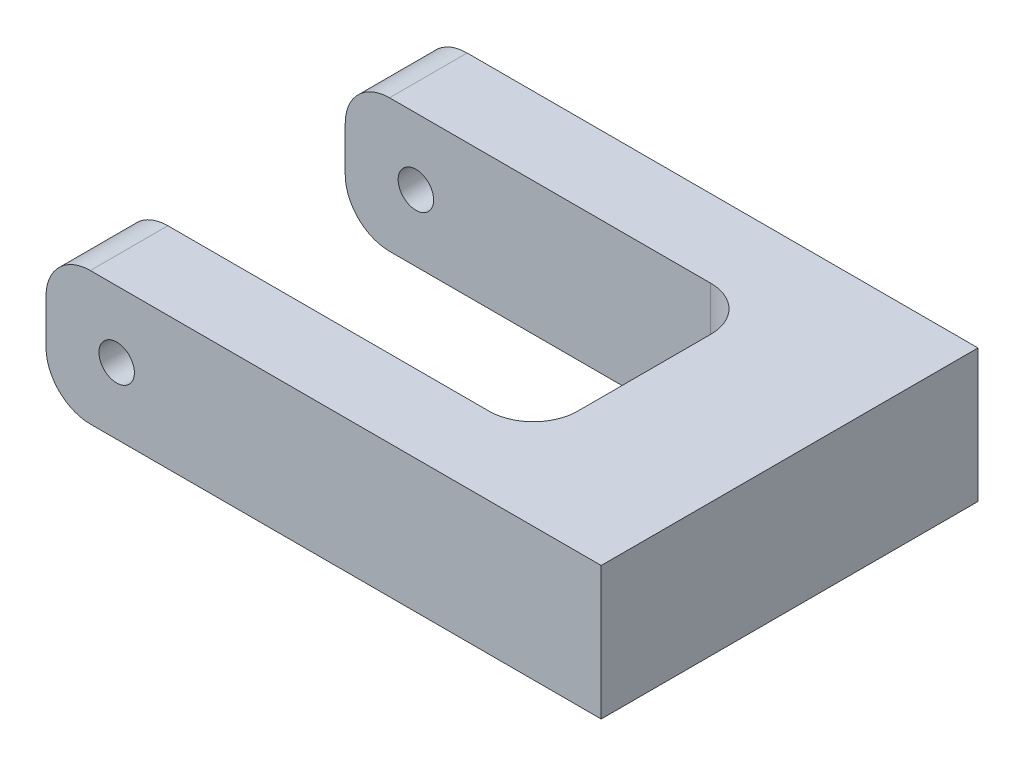
ISO-10303-21;
HEADER;
FILE_DESCRIPTION(('STEP AP214'),'2;1');
FILE_NAME('part.step','',(''),(''),'','','');
FILE_SCHEMA(('AUTOMOTIVE_DESIGN { 1 0 10303 214 1 1 1 1 }'));
ENDSEC;
DATA;
#1=APPLICATION_CONTEXT('core data for automotive mechanical design processes');
#2=APPLICATION_PROTOCOL_DEFINITION('international standard','automotive_design',2000,#1);
#3=PRODUCT_CONTEXT('',#1,'mechanical');
#4=PRODUCT('Part','Part','',(#3));
#5=PRODUCT_RELATED_PRODUCT_CATEGORY('part','',(#4));
#6=PRODUCT_DEFINITION_FORMATION('','',#4);
#7=PRODUCT_DEFINITION_CONTEXT('part definition',#1,'design');
#8=PRODUCT_DEFINITION('design','',#6,#7);
#9=PRODUCT_DEFINITION_SHAPE('','',#8);
#10=(LENGTH_UNIT() NAMED_UNIT(*) SI_UNIT(.MILLI.,.METRE.));
#11=(NAMED_UNIT(*) PLANE_ANGLE_UNIT() SI_UNIT($,.RADIAN.));
#12=(NAMED_UNIT(*) SI_UNIT($,.STERADIAN.) SOLID_ANGLE_UNIT());
#13=UNCERTAINTY_MEASURE_WITH_UNIT(LENGTH_MEASURE(1.E-05),#10,'distance_accuracy_value','');
#14=(GEOMETRIC_REPRESENTATION_CONTEXT(3) GLOBAL_UNCERTAINTY_ASSIGNED_CONTEXT((#13)) GLOBAL_UNIT_ASSIGNED_CONTEXT((#10,
#11,#12)) REPRESENTATION_CONTEXT('',''));
#15=CARTESIAN_POINT('',(0.,0.,0.));
#16=DIRECTION('',(0.,0.,1.));
#17=DIRECTION('',(1.,0.,0.));
#18=AXIS2_PLACEMENT_3D('',#15,#16,#17);
#19=CARTESIAN_POINT('',(9.88514391780015,-4.0419007614435,-77.5));
#20=DIRECTION('',(0.,0.,1.));
#21=DIRECTION('',(1.,0.,0.));
#22=AXIS2_PLACEMENT_3D('',#19,#20,#21);
#23=CYLINDRICAL_SURFACE('',#22,10.);
#24=CARTESIAN_POINT('',(9.88514391780015,-4.0419007614435,-60.));
#25=DIRECTION('',(0.,0.,-1.));
#26=DIRECTION('',(-1.,0.,0.));
#27=AXIS2_PLACEMENT_3D('',#24,#25,#26);
#28=CIRCLE('',#27,10.);
#29=CARTESIAN_POINT('',(9.88514391780015,5.9580992385565,-60.));
#30=VERTEX_POINT('',#29);
#31=CARTESIAN_POINT('',(-0.114856082199853,-4.0419007614435,-60.));
#32=VERTEX_POINT('',#31);
#33=EDGE_CURVE('E212',#30,#32,#28,.F.);
#34=ORIENTED_EDGE('',*,*,#33,.F.);
#35=DIRECTION('',(0.,0.,1.));
#36=VECTOR('',#35,1.);
#37=CARTESIAN_POINT('',(9.88514391780015,5.9580992385565,-77.5));
#38=LINE('',#37,#36);
#39=CARTESIAN_POINT('',(9.88514391780015,5.9580992385565,-77.5));
#40=VERTEX_POINT('',#39);
#41=EDGE_CURVE('E144',#40,#30,#38,.T.);
#42=ORIENTED_EDGE('',*,*,#41,.F.);
#43=CARTESIAN_POINT('',(9.88514391780015,-4.0419007614435,-77.5));
#44=DIRECTION('',(0.,0.,1.));
#45=DIRECTION('',(-1.,0.,0.));
#46=AXIS2_PLACEMENT_3D('',#43,#44,#45);
#47=CIRCLE('',#46,10.);
#48=CARTESIAN_POINT('',(-0.114856082199853,-4.0419007614435,-77.5));
#49=VERTEX_POINT('',#48);
#50=EDGE_CURVE('E219',#40,#49,#47,.T.);
#51=ORIENTED_EDGE('',*,*,#50,.T.);
#52=DIRECTION('',(0.,0.,1.));
#53=VECTOR('',#52,1.);
#54=CARTESIAN_POINT('',(-0.114856082199853,-4.0419007614435,-77.5));
#55=LINE('',#54,#53);
#56=EDGE_CURVE('E160',#49,#32,#55,.T.);
#57=ORIENTED_EDGE('',*,*,#56,.T.);
#58=EDGE_LOOP('',(#34,#42,#51,#57));
#59=FACE_BOUND('',#58,.T.);
#60=ADVANCED_FACE('F32',(#59),#23,.T.);
#61=CARTESIAN_POINT('',(9.88514391780015,-14.0419007614435,-77.5));
#62=DIRECTION('',(0.,0.,1.));
#63=DIRECTION('',(1.,0.,0.));
#64=AXIS2_PLACEMENT_3D('',#61,#62,#63);
#65=CYLINDRICAL_SURFACE('',#64,10.);
#66=CARTESIAN_POINT('',(9.88514391780015,-14.0419007614435,-60.));
#67=DIRECTION('',(0.,0.,-1.));
#68=DIRECTION('',(-1.,0.,0.));
#69=AXIS2_PLACEMENT_3D('',#66,#67,#68);
#70=CIRCLE('',#69,10.);
#71=CARTESIAN_POINT('',(-0.114856082199851,-14.0419007614435,-60.));
#72=VERTEX_POINT('',#71);
#73=CARTESIAN_POINT('',(9.88514391780015,-24.0419007614435,-60.));
#74=VERTEX_POINT('',#73);
#75=EDGE_CURVE('E210',#72,#74,#70,.F.);
#76=ORIENTED_EDGE('',*,*,#75,.F.);
#77=DIRECTION('',(0.,0.,1.));
#78=VECTOR('',#77,1.);
#79=CARTESIAN_POINT('',(-0.114856082199851,-14.0419007614435,-77.5));
#80=LINE('',#79,#78);
#81=CARTESIAN_POINT('',(-0.114856082199851,-14.0419007614435,-77.5));
#82=VERTEX_POINT('',#81);
#83=EDGE_CURVE('E169',#82,#72,#80,.T.);
#84=ORIENTED_EDGE('',*,*,#83,.F.);
#85=CARTESIAN_POINT('',(9.88514391780015,-14.0419007614435,-77.5));
#86=DIRECTION('',(0.,0.,1.));
#87=DIRECTION('',(1.,0.,0.));
#88=AXIS2_PLACEMENT_3D('',#85,#86,#87);
#89=CIRCLE('',#88,10.);
#90=CARTESIAN_POINT('',(9.88514391780015,-24.0419007614435,-77.5));
#91=VERTEX_POINT('',#90);
#92=EDGE_CURVE('E226',#82,#91,#89,.T.);
#93=ORIENTED_EDGE('',*,*,#92,.T.);
#94=DIRECTION('',(0.,0.,1.));
#95=VECTOR('',#94,1.);
#96=CARTESIAN_POINT('',(9.88514391780015,-24.0419007614435,-77.5));
#97=LINE('',#96,#95);
#98=EDGE_CURVE('E251',#91,#74,#97,.T.);
#99=ORIENTED_EDGE('',*,*,#98,.T.);
#100=EDGE_LOOP('',(#76,#84,#93,#99));
#101=FACE_BOUND('',#100,.T.);
#102=ADVANCED_FACE('F294',(#101),#65,.T.);
#103=CARTESIAN_POINT('',(-0.114856082199853,-4.0419007614435,-77.5));
#104=DIRECTION('',(-1.,0.,0.));
#105=DIRECTION('',(0.,-1.,0.));
#106=AXIS2_PLACEMENT_3D('',#103,#104,#105);
#107=PLANE('',#106);
#108=DIRECTION('',(0.,-1.,0.));
#109=VECTOR('',#108,1.);
#110=CARTESIAN_POINT('',(-0.114856082199853,-4.0419007614435,-60.));
#111=LINE('',#110,#109);
#112=EDGE_CURVE('E143',#32,#72,#111,.T.);
#113=ORIENTED_EDGE('',*,*,#112,.F.);
#114=ORIENTED_EDGE('',*,*,#56,.F.);
#115=DIRECTION('',(0.,-1.,0.));
#116=VECTOR('',#115,1.);
#117=CARTESIAN_POINT('',(-0.114856082199853,-4.0419007614435,-77.5));
#118=LINE('',#117,#116);
#119=EDGE_CURVE('E222',#49,#82,#118,.T.);
#120=ORIENTED_EDGE('',*,*,#119,.T.);
#121=ORIENTED_EDGE('',*,*,#83,.T.);
#122=EDGE_LOOP('',(#113,#114,#120,#121));
#123=FACE_BOUND('',#122,.T.);
#124=ADVANCED_FACE('F300',(#123),#107,.T.);
#125=CARTESIAN_POINT('',(9.88514391780015,-4.0419007614435,-10.));
#126=DIRECTION('',(0.,0.,1.));
#127=DIRECTION('',(1.,0.,0.));
#128=AXIS2_PLACEMENT_3D('',#125,#126,#127);
#129=CIRCLE('',#128,10.);
#130=CARTESIAN_POINT('',(-0.114856082199853,-4.0419007614435,-10.));
#131=VERTEX_POINT('',#130);
#132=CARTESIAN_POINT('',(9.88514391780015,5.9580992385565,-10.));
#133=VERTEX_POINT('',#132);
#134=EDGE_CURVE('E136',#131,#133,#129,.F.);
#135=ORIENTED_EDGE('',*,*,#134,.F.);
#136=CARTESIAN_POINT('',(-0.114856082199853,-4.0419007614435,7.5));
#137=VERTEX_POINT('',#136);
#138=EDGE_CURVE('E150',#131,#137,#55,.T.);
#139=ORIENTED_EDGE('',*,*,#138,.T.);
#140=CARTESIAN_POINT('',(9.88514391780015,-4.0419007614435,7.5));
#141=DIRECTION('',(0.,0.,1.));
#142=DIRECTION('',(-1.,0.,0.));
#143=AXIS2_PLACEMENT_3D('',#140,#141,#142);
#144=CIRCLE('',#143,10.);
#145=CARTESIAN_POINT('',(9.88514391780015,5.9580992385565,7.5));
#146=VERTEX_POINT('',#145);
#147=EDGE_CURVE('E203',#146,#137,#144,.T.);
#148=ORIENTED_EDGE('',*,*,#147,.F.);
#149=EDGE_CURVE('E152',#133,#146,#38,.T.);
#150=ORIENTED_EDGE('',*,*,#149,.F.);
#151=EDGE_LOOP('',(#135,#139,#148,#150));
#152=FACE_BOUND('',#151,.T.);
#153=ADVANCED_FACE('F148',(#152),#23,.T.);
#154=CARTESIAN_POINT('',(9.88514391780015,5.9580992385565,-77.5));
#155=DIRECTION('',(0.,1.,0.));
#156=DIRECTION('',(0.,0.,1.));
#157=AXIS2_PLACEMENT_3D('',#154,#155,#156);
#158=PLANE('',#157);
#159=DIRECTION('',(-1.,0.,0.));
#160=VECTOR('',#159,1.);
#161=CARTESIAN_POINT('',(9.88514391780015,5.9580992385565,-60.));
#162=LINE('',#161,#160);
#163=CARTESIAN_POINT('',(82.3281950153062,5.9580992385565,-60.));
#164=VERTEX_POINT('',#163);
#165=EDGE_CURVE('E199',#164,#30,#162,.T.);
#166=ORIENTED_EDGE('',*,*,#165,.F.);
#167=CARTESIAN_POINT('',(82.3281950153062,5.9580992385565,-50.));
#168=DIRECTION('',(0.,1.,0.));
#169=DIRECTION('',(0.,0.,1.));
#170=AXIS2_PLACEMENT_3D('',#167,#168,#169);
#171=CIRCLE('',#170,10.);
#172=CARTESIAN_POINT('',(92.3281950153062,5.9580992385565,-50.));
#173=VERTEX_POINT('',#172);
#174=EDGE_CURVE('E40',#164,#173,#171,.F.);
#175=ORIENTED_EDGE('',*,*,#174,.T.);
#176=DIRECTION('',(0.,0.,-1.));
#177=VECTOR('',#176,1.);
#178=CARTESIAN_POINT('',(92.3281950153062,5.9580992385565,-77.5));
#179=LINE('',#178,#177);
#180=CARTESIAN_POINT('',(92.3281950153062,5.9580992385565,-20.));
#181=VERTEX_POINT('',#180);
#182=EDGE_CURVE('E197',#181,#173,#179,.T.);
#183=ORIENTED_EDGE('',*,*,#182,.F.);
#184=CARTESIAN_POINT('',(82.3281950153062,5.9580992385565,-20.));
#185=DIRECTION('',(0.,1.,0.));
#186=DIRECTION('',(0.,0.,1.));
#187=AXIS2_PLACEMENT_3D('',#184,#185,#186);
#188=CIRCLE('',#187,10.);
#189=CARTESIAN_POINT('',(82.3281950153062,5.9580992385565,-10.));
#190=VERTEX_POINT('',#189);
#191=EDGE_CURVE('E189',#181,#190,#188,.F.);
#192=ORIENTED_EDGE('',*,*,#191,.T.);
#193=DIRECTION('',(1.,0.,0.));
#194=VECTOR('',#193,1.);
#195=CARTESIAN_POINT('',(9.88514391780015,5.9580992385565,-10.));
#196=LINE('',#195,#194);
#197=EDGE_CURVE('E153',#133,#190,#196,.T.);
#198=ORIENTED_EDGE('',*,*,#197,.F.);
#199=ORIENTED_EDGE('',*,*,#149,.T.);
#200=DIRECTION('',(-1.,0.,0.));
#201=VECTOR('',#200,1.);
#202=CARTESIAN_POINT('',(9.88514391780015,5.9580992385565,7.5));
#203=LINE('',#202,#201);
#204=CARTESIAN_POINT('',(125.13165801171,5.9580992385565,7.5));
#205=VERTEX_POINT('',#204);
#206=EDGE_CURVE('E223',#205,#146,#203,.T.);
#207=ORIENTED_EDGE('',*,*,#206,.F.);
#208=DIRECTION('',(0.,0.,1.));
#209=VECTOR('',#208,1.);
#210=CARTESIAN_POINT('',(125.13165801171,5.9580992385565,-77.5));
#211=LINE('',#210,#209);
#212=CARTESIAN_POINT('',(125.13165801171,5.9580992385565,-77.5));
#213=VERTEX_POINT('',#212);
#214=EDGE_CURVE('E248',#213,#205,#211,.T.);
#215=ORIENTED_EDGE('',*,*,#214,.F.);
#216=DIRECTION('',(-1.,0.,0.));
#217=VECTOR('',#216,1.);
#218=CARTESIAN_POINT('',(9.88514391780015,5.9580992385565,-77.5));
#219=LINE('',#218,#217);
#220=EDGE_CURVE('E161',#213,#40,#219,.T.);
#221=ORIENTED_EDGE('',*,*,#220,.T.);
#222=ORIENTED_EDGE('',*,*,#41,.T.);
#223=EDGE_LOOP('',(#166,#175,#183,#192,#198,#199,#207,#215,#221,#222));
#224=FACE_BOUND('',#223,.T.);
#225=ADVANCED_FACE('F196',(#224),#158,.T.);
#226=CARTESIAN_POINT('',(125.13165801171,5.9580992385565,-77.5));
#227=DIRECTION('',(1.,0.,0.));
#228=DIRECTION('',(0.,0.,-1.));
#229=AXIS2_PLACEMENT_3D('',#226,#227,#228);
#230=PLANE('',#229);
#231=DIRECTION('',(0.,1.,0.));
#232=VECTOR('',#231,1.);
#233=CARTESIAN_POINT('',(125.13165801171,5.9580992385565,7.5));
#234=LINE('',#233,#232);
#235=CARTESIAN_POINT('',(125.13165801171,-24.0419007614435,7.5));
#236=VERTEX_POINT('',#235);
#237=EDGE_CURVE('E242',#236,#205,#234,.T.);
#238=ORIENTED_EDGE('',*,*,#237,.F.);
#239=DIRECTION('',(0.,0.,1.));
#240=VECTOR('',#239,1.);
#241=CARTESIAN_POINT('',(125.13165801171,-24.0419007614435,-77.5));
#242=LINE('',#241,#240);
#243=CARTESIAN_POINT('',(125.13165801171,-24.0419007614435,-77.5));
#244=VERTEX_POINT('',#243);
#245=EDGE_CURVE('E250',#244,#236,#242,.T.);
#246=ORIENTED_EDGE('',*,*,#245,.F.);
#247=DIRECTION('',(0.,1.,0.));
#248=VECTOR('',#247,1.);
#249=CARTESIAN_POINT('',(125.13165801171,5.9580992385565,-77.5));
#250=LINE('',#249,#248);
#251=EDGE_CURVE('E166',#244,#213,#250,.T.);
#252=ORIENTED_EDGE('',*,*,#251,.T.);
#253=ORIENTED_EDGE('',*,*,#214,.T.);
#254=EDGE_LOOP('',(#238,#246,#252,#253));
#255=FACE_BOUND('',#254,.T.);
#256=ADVANCED_FACE('F308',(#255),#230,.T.);
#257=CARTESIAN_POINT('',(9.88514391780015,-24.0419007614435,-77.5));
#258=DIRECTION('',(0.,-1.,0.));
#259=DIRECTION('',(0.,0.,-1.));
#260=AXIS2_PLACEMENT_3D('',#257,#258,#259);
#261=PLANE('',#260);
#262=DIRECTION('',(1.,0.,0.));
#263=VECTOR('',#262,1.);
#264=CARTESIAN_POINT('',(9.88514391780015,-24.0419007614435,-60.));
#265=LINE('',#264,#263);
#266=CARTESIAN_POINT('',(82.3281950153062,-24.0419007614435,-60.));
#267=VERTEX_POINT('',#266);
#268=EDGE_CURVE('E208',#74,#267,#265,.T.);
#269=ORIENTED_EDGE('',*,*,#268,.F.);
#270=ORIENTED_EDGE('',*,*,#98,.F.);
#271=DIRECTION('',(1.,0.,0.));
#272=VECTOR('',#271,1.);
#273=CARTESIAN_POINT('',(9.88514391780015,-24.0419007614435,-77.5));
#274=LINE('',#273,#272);
#275=EDGE_CURVE('E229',#91,#244,#274,.T.);
#276=ORIENTED_EDGE('',*,*,#275,.T.);
#277=ORIENTED_EDGE('',*,*,#245,.T.);
#278=DIRECTION('',(1.,0.,0.));
#279=VECTOR('',#278,1.);
#280=CARTESIAN_POINT('',(9.88514391780015,-24.0419007614435,7.5));
#281=LINE('',#280,#279);
#282=CARTESIAN_POINT('',(9.88514391780015,-24.0419007614435,7.5));
#283=VERTEX_POINT('',#282);
#284=EDGE_CURVE('E239',#283,#236,#281,.T.);
#285=ORIENTED_EDGE('',*,*,#284,.F.);
#286=CARTESIAN_POINT('',(9.88514391780015,-24.0419007614435,-10.));
#287=VERTEX_POINT('',#286);
#288=EDGE_CURVE('E252',#287,#283,#97,.T.);
#289=ORIENTED_EDGE('',*,*,#288,.F.);
#290=DIRECTION('',(-1.,0.,0.));
#291=VECTOR('',#290,1.);
#292=CARTESIAN_POINT('',(9.88514391780015,-24.0419007614435,-10.));
#293=LINE('',#292,#291);
#294=CARTESIAN_POINT('',(82.3281950153062,-24.0419007614435,-10.));
#295=VERTEX_POINT('',#294);
#296=EDGE_CURVE('E154',#295,#287,#293,.T.);
#297=ORIENTED_EDGE('',*,*,#296,.F.);
#298=CARTESIAN_POINT('',(82.3281950153062,-24.0419007614435,-20.));
#299=DIRECTION('',(0.,-1.,0.));
#300=DIRECTION('',(0.,0.,-1.));
#301=AXIS2_PLACEMENT_3D('',#298,#299,#300);
#302=CIRCLE('',#301,10.);
#303=CARTESIAN_POINT('',(92.3281950153062,-24.0419007614435,-20.));
#304=VERTEX_POINT('',#303);
#305=EDGE_CURVE('E191',#295,#304,#302,.F.);
#306=ORIENTED_EDGE('',*,*,#305,.T.);
#307=DIRECTION('',(0.,0.,1.));
#308=VECTOR('',#307,1.);
#309=CARTESIAN_POINT('',(92.3281950153062,-24.0419007614435,-77.5));
#310=LINE('',#309,#308);
#311=CARTESIAN_POINT('',(92.3281950153062,-24.0419007614435,-50.));
#312=VERTEX_POINT('',#311);
#313=EDGE_CURVE('E173',#312,#304,#310,.T.);
#314=ORIENTED_EDGE('',*,*,#313,.F.);
#315=CARTESIAN_POINT('',(82.3281950153062,-24.0419007614435,-50.));
#316=DIRECTION('',(0.,-1.,0.));
#317=DIRECTION('',(0.,0.,-1.));
#318=AXIS2_PLACEMENT_3D('',#315,#316,#317);
#319=CIRCLE('',#318,10.);
#320=EDGE_CURVE('E11',#312,#267,#319,.F.);
#321=ORIENTED_EDGE('',*,*,#320,.T.);
#322=EDGE_LOOP('',(#269,#270,#276,#277,#285,#289,#297,#306,#314,#321));
#323=FACE_BOUND('',#322,.T.);
#324=ADVANCED_FACE('F320',(#323),#261,.T.);
#325=CARTESIAN_POINT('',(9.88514391780015,-14.0419007614435,-10.));
#326=DIRECTION('',(0.,0.,1.));
#327=DIRECTION('',(1.,0.,0.));
#328=AXIS2_PLACEMENT_3D('',#325,#326,#327);
#329=CIRCLE('',#328,10.);
#330=CARTESIAN_POINT('',(-0.114856082199851,-14.0419007614435,-10.));
#331=VERTEX_POINT('',#330);
#332=EDGE_CURVE('E139',#287,#331,#329,.F.);
#333=ORIENTED_EDGE('',*,*,#332,.F.);
#334=ORIENTED_EDGE('',*,*,#288,.T.);
#335=CARTESIAN_POINT('',(9.88514391780015,-14.0419007614435,7.5));
#336=DIRECTION('',(0.,0.,1.));
#337=DIRECTION('',(1.,0.,0.));
#338=AXIS2_PLACEMENT_3D('',#335,#336,#337);
#339=CIRCLE('',#338,10.);
#340=CARTESIAN_POINT('',(-0.114856082199851,-14.0419007614435,7.5));
#341=VERTEX_POINT('',#340);
#342=EDGE_CURVE('E236',#341,#283,#339,.T.);
#343=ORIENTED_EDGE('',*,*,#342,.F.);
#344=EDGE_CURVE('E164',#331,#341,#80,.T.);
#345=ORIENTED_EDGE('',*,*,#344,.F.);
#346=EDGE_LOOP('',(#333,#334,#343,#345));
#347=FACE_BOUND('',#346,.T.);
#348=ADVANCED_FACE('F261',(#347),#65,.T.);
#349=DIRECTION('',(0.,1.,0.));
#350=VECTOR('',#349,1.);
#351=CARTESIAN_POINT('',(-0.114856082199853,-4.0419007614435,-10.));
#352=LINE('',#351,#350);
#353=EDGE_CURVE('E132',#331,#131,#352,.T.);
#354=ORIENTED_EDGE('',*,*,#353,.F.);
#355=ORIENTED_EDGE('',*,*,#344,.T.);
#356=DIRECTION('',(0.,-1.,0.));
#357=VECTOR('',#356,1.);
#358=CARTESIAN_POINT('',(-0.114856082199853,-4.0419007614435,7.5));
#359=LINE('',#358,#357);
#360=EDGE_CURVE('E158',#137,#341,#359,.T.);
#361=ORIENTED_EDGE('',*,*,#360,.F.);
#362=ORIENTED_EDGE('',*,*,#138,.F.);
#363=EDGE_LOOP('',(#354,#355,#361,#362));
#364=FACE_BOUND('',#363,.T.);
#365=ADVANCED_FACE('F156',(#364),#107,.T.);
#366=CARTESIAN_POINT('',(9.88514391780015,-4.0419007614435,-77.5));
#367=DIRECTION('',(0.,0.,-1.));
#368=DIRECTION('',(-1.,0.,0.));
#369=AXIS2_PLACEMENT_3D('',#366,#367,#368);
#370=PLANE('',#369);
#371=CARTESIAN_POINT('',(15.8239530552189,-9.0419007614435,-77.5));
#372=DIRECTION('',(0.,0.,-1.));
#373=DIRECTION('',(-1.,0.,0.));
#374=AXIS2_PLACEMENT_3D('',#371,#372,#373);
#375=CIRCLE('',#374,4.);
#376=CARTESIAN_POINT('',(11.8239530552189,-9.0419007614435,-77.5));
#377=VERTEX_POINT('',#376);
#378=EDGE_CURVE('E270',#377,#377,#375,.T.);
#379=ORIENTED_EDGE('',*,*,#378,.F.);
#380=EDGE_LOOP('',(#379));
#381=FACE_BOUND('',#380,.T.);
#382=ORIENTED_EDGE('',*,*,#50,.F.);
#383=ORIENTED_EDGE('',*,*,#220,.F.);
#384=ORIENTED_EDGE('',*,*,#251,.F.);
#385=ORIENTED_EDGE('',*,*,#275,.F.);
#386=ORIENTED_EDGE('',*,*,#92,.F.);
#387=ORIENTED_EDGE('',*,*,#119,.F.);
#388=EDGE_LOOP('',(#382,#383,#384,#385,#386,#387));
#389=FACE_BOUND('',#388,.T.);
#390=ADVANCED_FACE('F313',(#381,#389),#370,.T.);
#391=CARTESIAN_POINT('',(9.88514391780015,-4.0419007614435,7.5));
#392=DIRECTION('',(0.,0.,-1.));
#393=DIRECTION('',(-1.,0.,0.));
#394=AXIS2_PLACEMENT_3D('',#391,#392,#393);
#395=PLANE('',#394);
#396=CARTESIAN_POINT('',(15.8239530552189,-9.0419007614435,7.50000000000001));
#397=DIRECTION('',(0.,0.,-1.));
#398=DIRECTION('',(-1.,0.,0.));
#399=AXIS2_PLACEMENT_3D('',#396,#397,#398);
#400=CIRCLE('',#399,4.);
#401=CARTESIAN_POINT('',(11.8239530552189,-9.0419007614435,7.50000000000001));
#402=VERTEX_POINT('',#401);
#403=EDGE_CURVE('E273',#402,#402,#400,.T.);
#404=ORIENTED_EDGE('',*,*,#403,.T.);
#405=EDGE_LOOP('',(#404));
#406=FACE_BOUND('',#405,.T.);
#407=ORIENTED_EDGE('',*,*,#147,.T.);
#408=ORIENTED_EDGE('',*,*,#360,.T.);
#409=ORIENTED_EDGE('',*,*,#342,.T.);
#410=ORIENTED_EDGE('',*,*,#284,.T.);
#411=ORIENTED_EDGE('',*,*,#237,.T.);
#412=ORIENTED_EDGE('',*,*,#206,.T.);
#413=EDGE_LOOP('',(#407,#408,#409,#410,#411,#412));
#414=FACE_BOUND('',#413,.T.);
#415=ADVANCED_FACE('F263',(#406,#414),#395,.F.);
#416=CARTESIAN_POINT('',(-2.26609945987824,-43.5,-60.));
#417=DIRECTION('',(0.,0.,-1.));
#418=DIRECTION('',(-1.,0.,0.));
#419=AXIS2_PLACEMENT_3D('',#416,#417,#418);
#420=PLANE('',#419);
#421=CARTESIAN_POINT('',(15.8239530552189,-9.0419007614435,-60.));
#422=DIRECTION('',(0.,0.,-1.));
#423=DIRECTION('',(-1.,0.,0.));
#424=AXIS2_PLACEMENT_3D('',#421,#422,#423);
#425=CIRCLE('',#424,4.);
#426=CARTESIAN_POINT('',(11.8239530552189,-9.0419007614435,-60.));
#427=VERTEX_POINT('',#426);
#428=EDGE_CURVE('E180',#427,#427,#425,.T.);
#429=ORIENTED_EDGE('',*,*,#428,.T.);
#430=EDGE_LOOP('',(#429));
#431=FACE_BOUND('',#430,.T.);
#432=ORIENTED_EDGE('',*,*,#268,.T.);
#433=DIRECTION('',(0.,1.,0.));
#434=VECTOR('',#433,1.);
#435=CARTESIAN_POINT('',(82.3281950153062,5.9580992385565,-60.));
#436=LINE('',#435,#434);
#437=EDGE_CURVE('E187',#267,#164,#436,.T.);
#438=ORIENTED_EDGE('',*,*,#437,.T.);
#439=ORIENTED_EDGE('',*,*,#165,.T.);
#440=ORIENTED_EDGE('',*,*,#33,.T.);
#441=ORIENTED_EDGE('',*,*,#112,.T.);
#442=ORIENTED_EDGE('',*,*,#75,.T.);
#443=EDGE_LOOP('',(#432,#438,#439,#440,#441,#442));
#444=FACE_BOUND('',#443,.T.);
#445=ADVANCED_FACE('F206',(#431,#444),#420,.F.);
#446=CARTESIAN_POINT('',(92.3281950153062,-43.5,-60.));
#447=DIRECTION('',(1.,0.,0.));
#448=DIRECTION('',(0.,0.,-1.));
#449=AXIS2_PLACEMENT_3D('',#446,#447,#448);
#450=PLANE('',#449);
#451=ORIENTED_EDGE('',*,*,#313,.T.);
#452=DIRECTION('',(0.,1.,0.));
#453=VECTOR('',#452,1.);
#454=CARTESIAN_POINT('',(92.3281950153062,5.9580992385565,-20.));
#455=LINE('',#454,#453);
#456=EDGE_CURVE('E182',#304,#181,#455,.T.);
#457=ORIENTED_EDGE('',*,*,#456,.T.);
#458=ORIENTED_EDGE('',*,*,#182,.T.);
#459=DIRECTION('',(0.,1.,0.));
#460=VECTOR('',#459,1.);
#461=CARTESIAN_POINT('',(92.3281950153062,-24.0419007614435,-50.));
#462=LINE('',#461,#460);
#463=EDGE_CURVE('E176',#173,#312,#462,.F.);
#464=ORIENTED_EDGE('',*,*,#463,.T.);
#465=EDGE_LOOP('',(#451,#457,#458,#464));
#466=FACE_BOUND('',#465,.T.);
#467=ADVANCED_FACE('F201',(#466),#450,.F.);
#468=CARTESIAN_POINT('',(92.3281950153062,-43.5,-10.));
#469=DIRECTION('',(0.,0.,1.));
#470=DIRECTION('',(1.,0.,0.));
#471=AXIS2_PLACEMENT_3D('',#468,#469,#470);
#472=PLANE('',#471);
#473=CARTESIAN_POINT('',(15.8239530552189,-9.0419007614435,-10.));
#474=DIRECTION('',(0.,0.,1.));
#475=DIRECTION('',(1.,0.,0.));
#476=AXIS2_PLACEMENT_3D('',#473,#474,#475);
#477=CIRCLE('',#476,4.);
#478=CARTESIAN_POINT('',(19.8239530552189,-9.0419007614435,-10.));
#479=VERTEX_POINT('',#478);
#480=EDGE_CURVE('E177',#479,#479,#477,.T.);
#481=ORIENTED_EDGE('',*,*,#480,.T.);
#482=EDGE_LOOP('',(#481));
#483=FACE_BOUND('',#482,.T.);
#484=ORIENTED_EDGE('',*,*,#197,.T.);
#485=DIRECTION('',(0.,1.,0.));
#486=VECTOR('',#485,1.);
#487=CARTESIAN_POINT('',(82.3281950153062,-24.0419007614435,-10.));
#488=LINE('',#487,#486);
#489=EDGE_CURVE('E185',#190,#295,#488,.F.);
#490=ORIENTED_EDGE('',*,*,#489,.T.);
#491=ORIENTED_EDGE('',*,*,#296,.T.);
#492=ORIENTED_EDGE('',*,*,#332,.T.);
#493=ORIENTED_EDGE('',*,*,#353,.T.);
#494=ORIENTED_EDGE('',*,*,#134,.T.);
#495=EDGE_LOOP('',(#484,#490,#491,#492,#493,#494));
#496=FACE_BOUND('',#495,.T.);
#497=ADVANCED_FACE('F135',(#483,#496),#472,.F.);
#498=CARTESIAN_POINT('',(15.8239530552189,-9.0419007614435,-100.));
#499=DIRECTION('',(0.,0.,1.));
#500=DIRECTION('',(1.,0.,0.));
#501=AXIS2_PLACEMENT_3D('',#498,#499,#500);
#502=CYLINDRICAL_SURFACE('',#501,4.);
#503=ORIENTED_EDGE('',*,*,#480,.F.);
#504=EDGE_LOOP('',(#503));
#505=FACE_BOUND('',#504,.T.);
#506=ORIENTED_EDGE('',*,*,#403,.F.);
#507=EDGE_LOOP('',(#506));
#508=FACE_BOUND('',#507,.T.);
#509=ADVANCED_FACE('F283',(#505,#508),#502,.F.);
#510=ORIENTED_EDGE('',*,*,#378,.T.);
#511=EDGE_LOOP('',(#510));
#512=FACE_BOUND('',#511,.T.);
#513=ORIENTED_EDGE('',*,*,#428,.F.);
#514=EDGE_LOOP('',(#513));
#515=FACE_BOUND('',#514,.T.);
#516=ADVANCED_FACE('F280',(#512,#515),#502,.F.);
#517=CARTESIAN_POINT('',(82.3281950153062,-43.5,-20.));
#518=DIRECTION('',(0.,-1.,0.));
#519=DIRECTION('',(0.,0.,-1.));
#520=AXIS2_PLACEMENT_3D('',#517,#518,#519);
#521=CYLINDRICAL_SURFACE('',#520,10.);
#522=ORIENTED_EDGE('',*,*,#305,.F.);
#523=ORIENTED_EDGE('',*,*,#489,.F.);
#524=ORIENTED_EDGE('',*,*,#191,.F.);
#525=ORIENTED_EDGE('',*,*,#456,.F.);
#526=EDGE_LOOP('',(#522,#523,#524,#525));
#527=FACE_BOUND('',#526,.T.);
#528=ADVANCED_FACE('F282',(#527),#521,.F.);
#529=CARTESIAN_POINT('',(82.3281950153062,-43.5,-50.));
#530=DIRECTION('',(0.,-1.,0.));
#531=DIRECTION('',(0.,0.,-1.));
#532=AXIS2_PLACEMENT_3D('',#529,#530,#531);
#533=CYLINDRICAL_SURFACE('',#532,10.);
#534=ORIENTED_EDGE('',*,*,#320,.F.);
#535=ORIENTED_EDGE('',*,*,#463,.F.);
#536=ORIENTED_EDGE('',*,*,#174,.F.);
#537=ORIENTED_EDGE('',*,*,#437,.F.);
#538=EDGE_LOOP('',(#534,#535,#536,#537));
#539=FACE_BOUND('',#538,.T.);
#540=ADVANCED_FACE('F34',(#539),#533,.F.);
#541=CLOSED_SHELL('',(#60,#102,#124,#153,#225,#256,#324,#348,#365,#390,#415,#445,#467,#497,#509,
#516,#528,#540));
#542=MANIFOLD_SOLID_BREP('B2',#541);
#543=ADVANCED_BREP_SHAPE_REPRESENTATION('',(#18,#542),#14);
#544=SHAPE_DEFINITION_REPRESENTATION(#9,#543);
ENDSEC;
END-ISO-10303-21;
